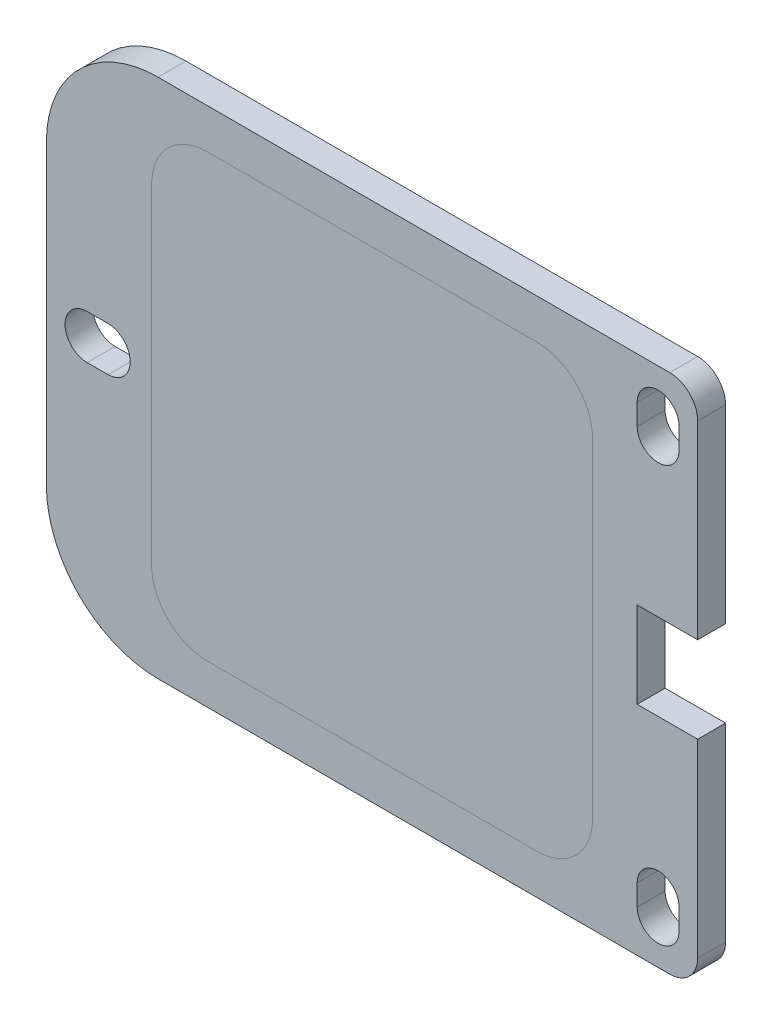
ISO-10303-21;
HEADER;
FILE_DESCRIPTION(('STEP AP214'),'2;1');
FILE_NAME('part.step','',(''),(''),'','','');
FILE_SCHEMA(('AUTOMOTIVE_DESIGN { 1 0 10303 214 1 1 1 1 }'));
ENDSEC;
DATA;
#1=APPLICATION_CONTEXT('core data for automotive mechanical design processes');
#2=APPLICATION_PROTOCOL_DEFINITION('international standard','automotive_design',2000,#1);
#3=PRODUCT_CONTEXT('',#1,'mechanical');
#4=PRODUCT('Part','Part','',(#3));
#5=PRODUCT_RELATED_PRODUCT_CATEGORY('part','',(#4));
#6=PRODUCT_DEFINITION_FORMATION('','',#4);
#7=PRODUCT_DEFINITION_CONTEXT('part definition',#1,'design');
#8=PRODUCT_DEFINITION('design','',#6,#7);
#9=PRODUCT_DEFINITION_SHAPE('','',#8);
#10=(LENGTH_UNIT() NAMED_UNIT(*) SI_UNIT(.MILLI.,.METRE.));
#11=(NAMED_UNIT(*) PLANE_ANGLE_UNIT() SI_UNIT($,.RADIAN.));
#12=(NAMED_UNIT(*) SI_UNIT($,.STERADIAN.) SOLID_ANGLE_UNIT());
#13=UNCERTAINTY_MEASURE_WITH_UNIT(LENGTH_MEASURE(1.E-05),#10,'distance_accuracy_value','');
#14=(GEOMETRIC_REPRESENTATION_CONTEXT(3) GLOBAL_UNCERTAINTY_ASSIGNED_CONTEXT((#13)) GLOBAL_UNIT_ASSIGNED_CONTEXT((#10,
#11,#12)) REPRESENTATION_CONTEXT('',''));
#15=CARTESIAN_POINT('',(0.,0.,0.));
#16=DIRECTION('',(0.,0.,1.));
#17=DIRECTION('',(1.,0.,0.));
#18=AXIS2_PLACEMENT_3D('',#15,#16,#17);
#19=CARTESIAN_POINT('',(0.,0.,19.05));
#20=DIRECTION('',(0.,0.,-1.));
#21=DIRECTION('',(-1.,0.,0.));
#22=AXIS2_PLACEMENT_3D('',#19,#20,#21);
#23=PLANE('',#22);
#24=CARTESIAN_POINT('',(195.2625,134.9248,19.05));
#25=DIRECTION('',(0.,0.,1.));
#26=DIRECTION('',(-1.,0.,0.));
#27=AXIS2_PLACEMENT_3D('',#24,#25,#26);
#28=CIRCLE('',#27,14.2875);
#29=CARTESIAN_POINT('',(180.975,134.9248,19.05));
#30=VERTEX_POINT('',#29);
#31=CARTESIAN_POINT('',(209.55,134.9248,19.05));
#32=VERTEX_POINT('',#31);
#33=EDGE_CURVE('E228',#30,#32,#28,.T.);
#34=ORIENTED_EDGE('',*,*,#33,.F.);
#35=DIRECTION('',(0.,-1.,0.));
#36=VECTOR('',#35,1.);
#37=CARTESIAN_POINT('',(180.975,134.9248,19.05));
#38=LINE('',#37,#36);
#39=CARTESIAN_POINT('',(180.975,149.225,19.05));
#40=VERTEX_POINT('',#39);
#41=EDGE_CURVE('E254',#40,#30,#38,.T.);
#42=ORIENTED_EDGE('',*,*,#41,.F.);
#43=CARTESIAN_POINT('',(195.2625,149.225,19.05));
#44=DIRECTION('',(0.,0.,1.));
#45=DIRECTION('',(-1.,0.,0.));
#46=AXIS2_PLACEMENT_3D('',#43,#44,#45);
#47=CIRCLE('',#46,14.2875);
#48=CARTESIAN_POINT('',(209.55,149.225,19.05));
#49=VERTEX_POINT('',#48);
#50=EDGE_CURVE('E252',#49,#40,#47,.T.);
#51=ORIENTED_EDGE('',*,*,#50,.F.);
#52=DIRECTION('',(0.,1.,0.));
#53=VECTOR('',#52,1.);
#54=CARTESIAN_POINT('',(209.55,134.9248,19.05));
#55=LINE('',#54,#53);
#56=EDGE_CURVE('E238',#32,#49,#55,.T.);
#57=ORIENTED_EDGE('',*,*,#56,.F.);
#58=EDGE_LOOP('',(#34,#42,#51,#57));
#59=FACE_BOUND('',#58,.T.);
#60=CARTESIAN_POINT('',(-194.4624,0.,19.05));
#61=DIRECTION('',(0.,0.,1.));
#62=DIRECTION('',(1.,0.,0.));
#63=AXIS2_PLACEMENT_3D('',#60,#61,#62);
#64=CIRCLE('',#63,15.08125);
#65=CARTESIAN_POINT('',(-194.4624,15.08125,19.05));
#66=VERTEX_POINT('',#65);
#67=CARTESIAN_POINT('',(-194.4624,-15.08125,19.05));
#68=VERTEX_POINT('',#67);
#69=EDGE_CURVE('E301',#66,#68,#64,.T.);
#70=ORIENTED_EDGE('',*,*,#69,.F.);
#71=DIRECTION('',(-1.,0.,0.));
#72=VECTOR('',#71,1.);
#73=CARTESIAN_POINT('',(-194.4624,15.08125,19.05));
#74=LINE('',#73,#72);
#75=CARTESIAN_POINT('',(-180.1749,15.08125,19.05));
#76=VERTEX_POINT('',#75);
#77=EDGE_CURVE('E309',#76,#66,#74,.T.);
#78=ORIENTED_EDGE('',*,*,#77,.F.);
#79=CARTESIAN_POINT('',(-180.1749,0.,19.05));
#80=DIRECTION('',(0.,0.,1.));
#81=DIRECTION('',(1.,0.,0.));
#82=AXIS2_PLACEMENT_3D('',#79,#80,#81);
#83=CIRCLE('',#82,15.08125);
#84=CARTESIAN_POINT('',(-180.1749,-15.08125,19.05));
#85=VERTEX_POINT('',#84);
#86=EDGE_CURVE('E306',#85,#76,#83,.T.);
#87=ORIENTED_EDGE('',*,*,#86,.F.);
#88=DIRECTION('',(1.,0.,0.));
#89=VECTOR('',#88,1.);
#90=CARTESIAN_POINT('',(-194.4624,-15.08125,19.05));
#91=LINE('',#90,#89);
#92=EDGE_CURVE('E303',#68,#85,#91,.T.);
#93=ORIENTED_EDGE('',*,*,#92,.F.);
#94=EDGE_LOOP('',(#70,#78,#87,#93));
#95=FACE_BOUND('',#94,.T.);
#96=DIRECTION('',(0.,1.,0.));
#97=VECTOR('',#96,1.);
#98=CARTESIAN_POINT('',(222.25,29.36875,19.05));
#99=LINE('',#98,#97);
#100=CARTESIAN_POINT('',(222.25,29.36875,19.05));
#101=VERTEX_POINT('',#100);
#102=CARTESIAN_POINT('',(222.25,158.75,19.05));
#103=VERTEX_POINT('',#102);
#104=EDGE_CURVE('E332',#101,#103,#99,.T.);
#105=ORIENTED_EDGE('',*,*,#104,.T.);
#106=CARTESIAN_POINT('',(203.2,158.75,19.05));
#107=DIRECTION('',(0.,0.,-1.));
#108=DIRECTION('',(-1.,0.,0.));
#109=AXIS2_PLACEMENT_3D('',#106,#107,#108);
#110=CIRCLE('',#109,19.05);
#111=CARTESIAN_POINT('',(203.2,177.8,19.05));
#112=VERTEX_POINT('',#111);
#113=EDGE_CURVE('E446',#103,#112,#110,.F.);
#114=ORIENTED_EDGE('',*,*,#113,.T.);
#115=DIRECTION('',(-1.,0.,0.));
#116=VECTOR('',#115,1.);
#117=CARTESIAN_POINT('',(-222.25,177.8,19.05));
#118=LINE('',#117,#116);
#119=CARTESIAN_POINT('',(-146.05,177.8,19.05));
#120=VERTEX_POINT('',#119);
#121=EDGE_CURVE('E335',#112,#120,#118,.T.);
#122=ORIENTED_EDGE('',*,*,#121,.T.);
#123=CARTESIAN_POINT('',(-146.05,101.6,19.05));
#124=DIRECTION('',(0.,0.,-1.));
#125=DIRECTION('',(-1.,0.,0.));
#126=AXIS2_PLACEMENT_3D('',#123,#124,#125);
#127=CIRCLE('',#126,76.2);
#128=CARTESIAN_POINT('',(-222.25,101.6,19.05));
#129=VERTEX_POINT('',#128);
#130=EDGE_CURVE('E431',#120,#129,#127,.F.);
#131=ORIENTED_EDGE('',*,*,#130,.T.);
#132=DIRECTION('',(0.,-1.,0.));
#133=VECTOR('',#132,1.);
#134=CARTESIAN_POINT('',(-222.25,-177.8,19.05));
#135=LINE('',#134,#133);
#136=CARTESIAN_POINT('',(-222.25,-101.6,19.05));
#137=VERTEX_POINT('',#136);
#138=EDGE_CURVE('E338',#129,#137,#135,.T.);
#139=ORIENTED_EDGE('',*,*,#138,.T.);
#140=CARTESIAN_POINT('',(-146.05,-101.6,19.05));
#141=DIRECTION('',(0.,0.,-1.));
#142=DIRECTION('',(-1.,0.,0.));
#143=AXIS2_PLACEMENT_3D('',#140,#141,#142);
#144=CIRCLE('',#143,76.2);
#145=CARTESIAN_POINT('',(-146.05,-177.8,19.05));
#146=VERTEX_POINT('',#145);
#147=EDGE_CURVE('E429',#137,#146,#144,.F.);
#148=ORIENTED_EDGE('',*,*,#147,.T.);
#149=DIRECTION('',(1.,0.,0.));
#150=VECTOR('',#149,1.);
#151=CARTESIAN_POINT('',(-222.25,-177.8,19.05));
#152=LINE('',#151,#150);
#153=CARTESIAN_POINT('',(203.2,-177.8,19.05));
#154=VERTEX_POINT('',#153);
#155=EDGE_CURVE('E341',#146,#154,#152,.T.);
#156=ORIENTED_EDGE('',*,*,#155,.T.);
#157=CARTESIAN_POINT('',(203.2,-158.75,19.05));
#158=DIRECTION('',(0.,0.,-1.));
#159=DIRECTION('',(-1.,0.,0.));
#160=AXIS2_PLACEMENT_3D('',#157,#158,#159);
#161=CIRCLE('',#160,19.05);
#162=CARTESIAN_POINT('',(222.25,-158.75,19.05));
#163=VERTEX_POINT('',#162);
#164=EDGE_CURVE('E57',#154,#163,#161,.F.);
#165=ORIENTED_EDGE('',*,*,#164,.T.);
#166=DIRECTION('',(0.,1.,0.));
#167=VECTOR('',#166,1.);
#168=CARTESIAN_POINT('',(222.25,-177.8,19.05));
#169=LINE('',#168,#167);
#170=CARTESIAN_POINT('',(222.25,-29.36875,19.05));
#171=VERTEX_POINT('',#170);
#172=EDGE_CURVE('E343',#163,#171,#169,.T.);
#173=ORIENTED_EDGE('',*,*,#172,.T.);
#174=DIRECTION('',(-1.,0.,0.));
#175=VECTOR('',#174,1.);
#176=CARTESIAN_POINT('',(222.25,-29.36875,19.05));
#177=LINE('',#176,#175);
#178=CARTESIAN_POINT('',(180.975,-29.36875,19.05));
#179=VERTEX_POINT('',#178);
#180=EDGE_CURVE('E345',#171,#179,#177,.T.);
#181=ORIENTED_EDGE('',*,*,#180,.T.);
#182=DIRECTION('',(0.,1.,0.));
#183=VECTOR('',#182,1.);
#184=CARTESIAN_POINT('',(180.975,29.36875,19.05));
#185=LINE('',#184,#183);
#186=CARTESIAN_POINT('',(180.975,29.36875,19.05));
#187=VERTEX_POINT('',#186);
#188=EDGE_CURVE('E347',#179,#187,#185,.T.);
#189=ORIENTED_EDGE('',*,*,#188,.T.);
#190=DIRECTION('',(1.,0.,0.));
#191=VECTOR('',#190,1.);
#192=CARTESIAN_POINT('',(222.25,29.36875,19.05));
#193=LINE('',#192,#191);
#194=EDGE_CURVE('E349',#187,#101,#193,.T.);
#195=ORIENTED_EDGE('',*,*,#194,.T.);
#196=EDGE_LOOP('',(#105,#114,#122,#131,#139,#148,#156,#165,#173,#181,#189,#195));
#197=FACE_BOUND('',#196,.T.);
#198=CARTESIAN_POINT('',(195.2625,-134.9248,19.05));
#199=DIRECTION('',(0.,0.,1.));
#200=DIRECTION('',(1.,0.,0.));
#201=AXIS2_PLACEMENT_3D('',#198,#199,#200);
#202=CIRCLE('',#201,14.2875);
#203=CARTESIAN_POINT('',(209.55,-134.9248,19.05));
#204=VERTEX_POINT('',#203);
#205=CARTESIAN_POINT('',(180.975,-134.9248,19.05));
#206=VERTEX_POINT('',#205);
#207=EDGE_CURVE('E270',#204,#206,#202,.T.);
#208=ORIENTED_EDGE('',*,*,#207,.F.);
#209=DIRECTION('',(0.,1.,0.));
#210=VECTOR('',#209,1.);
#211=CARTESIAN_POINT('',(209.55,-134.9248,19.05));
#212=LINE('',#211,#210);
#213=CARTESIAN_POINT('',(209.55,-149.225,19.05));
#214=VERTEX_POINT('',#213);
#215=EDGE_CURVE('E278',#214,#204,#212,.T.);
#216=ORIENTED_EDGE('',*,*,#215,.F.);
#217=CARTESIAN_POINT('',(195.2625,-149.225,19.05));
#218=DIRECTION('',(0.,0.,1.));
#219=DIRECTION('',(1.,0.,0.));
#220=AXIS2_PLACEMENT_3D('',#217,#218,#219);
#221=CIRCLE('',#220,14.2875);
#222=CARTESIAN_POINT('',(180.975,-149.225,19.05));
#223=VERTEX_POINT('',#222);
#224=EDGE_CURVE('E275',#223,#214,#221,.T.);
#225=ORIENTED_EDGE('',*,*,#224,.F.);
#226=DIRECTION('',(0.,-1.,0.));
#227=VECTOR('',#226,1.);
#228=CARTESIAN_POINT('',(180.975,-134.9248,19.05));
#229=LINE('',#228,#227);
#230=EDGE_CURVE('E272',#206,#223,#229,.T.);
#231=ORIENTED_EDGE('',*,*,#230,.F.);
#232=EDGE_LOOP('',(#208,#216,#225,#231));
#233=FACE_BOUND('',#232,.T.);
#234=CARTESIAN_POINT('',(112.395,-112.395,19.05));
#235=DIRECTION('',(0.,0.,-1.));
#236=DIRECTION('',(-1.,0.,0.));
#237=AXIS2_PLACEMENT_3D('',#234,#235,#236);
#238=CIRCLE('',#237,38.1);
#239=CARTESIAN_POINT('',(112.395,-150.495,19.05));
#240=VERTEX_POINT('',#239);
#241=CARTESIAN_POINT('',(150.495,-112.395,19.05));
#242=VERTEX_POINT('',#241);
#243=EDGE_CURVE('E413',#240,#242,#238,.F.);
#244=ORIENTED_EDGE('',*,*,#243,.F.);
#245=DIRECTION('',(1.,0.,0.));
#246=VECTOR('',#245,1.);
#247=CARTESIAN_POINT('',(0.,-150.495,19.05));
#248=LINE('',#247,#246);
#249=CARTESIAN_POINT('',(-112.395,-150.495,19.05));
#250=VERTEX_POINT('',#249);
#251=EDGE_CURVE('E391',#250,#240,#248,.T.);
#252=ORIENTED_EDGE('',*,*,#251,.F.);
#253=CARTESIAN_POINT('',(-112.395,-112.395,19.05));
#254=DIRECTION('',(0.,0.,-1.));
#255=DIRECTION('',(-1.,0.,0.));
#256=AXIS2_PLACEMENT_3D('',#253,#254,#255);
#257=CIRCLE('',#256,38.1);
#258=CARTESIAN_POINT('',(-150.495,-112.395,19.05));
#259=VERTEX_POINT('',#258);
#260=EDGE_CURVE('E395',#259,#250,#257,.F.);
#261=ORIENTED_EDGE('',*,*,#260,.F.);
#262=DIRECTION('',(0.,-1.,0.));
#263=VECTOR('',#262,1.);
#264=CARTESIAN_POINT('',(-150.495,0.,19.05));
#265=LINE('',#264,#263);
#266=CARTESIAN_POINT('',(-150.495,112.395,19.05));
#267=VERTEX_POINT('',#266);
#268=EDGE_CURVE('E398',#267,#259,#265,.T.);
#269=ORIENTED_EDGE('',*,*,#268,.F.);
#270=CARTESIAN_POINT('',(-112.395,112.395,19.05));
#271=DIRECTION('',(0.,0.,-1.));
#272=DIRECTION('',(-1.,0.,0.));
#273=AXIS2_PLACEMENT_3D('',#270,#271,#272);
#274=CIRCLE('',#273,38.1);
#275=CARTESIAN_POINT('',(-112.395,150.495,19.05));
#276=VERTEX_POINT('',#275);
#277=EDGE_CURVE('E401',#276,#267,#274,.F.);
#278=ORIENTED_EDGE('',*,*,#277,.F.);
#279=DIRECTION('',(-1.,0.,0.));
#280=VECTOR('',#279,1.);
#281=CARTESIAN_POINT('',(0.,150.495,19.05));
#282=LINE('',#281,#280);
#283=CARTESIAN_POINT('',(112.395,150.495,19.05));
#284=VERTEX_POINT('',#283);
#285=EDGE_CURVE('E404',#284,#276,#282,.T.);
#286=ORIENTED_EDGE('',*,*,#285,.F.);
#287=CARTESIAN_POINT('',(112.395,112.395,19.05));
#288=DIRECTION('',(0.,0.,-1.));
#289=DIRECTION('',(-1.,0.,0.));
#290=AXIS2_PLACEMENT_3D('',#287,#288,#289);
#291=CIRCLE('',#290,38.1);
#292=CARTESIAN_POINT('',(150.495,112.395,19.05));
#293=VERTEX_POINT('',#292);
#294=EDGE_CURVE('E407',#293,#284,#291,.F.);
#295=ORIENTED_EDGE('',*,*,#294,.F.);
#296=DIRECTION('',(0.,1.,0.));
#297=VECTOR('',#296,1.);
#298=CARTESIAN_POINT('',(150.495,0.,19.05));
#299=LINE('',#298,#297);
#300=EDGE_CURVE('E410',#242,#293,#299,.T.);
#301=ORIENTED_EDGE('',*,*,#300,.F.);
#302=EDGE_LOOP('',(#244,#252,#261,#269,#278,#286,#295,#301));
#303=FACE_BOUND('',#302,.T.);
#304=ADVANCED_FACE('F42',(#59,#95,#197,#233,#303),#23,.F.);
#305=CARTESIAN_POINT('',(0.,0.,0.));
#306=DIRECTION('',(0.,0.,-1.));
#307=DIRECTION('',(-1.,0.,0.));
#308=AXIS2_PLACEMENT_3D('',#305,#306,#307);
#309=PLANE('',#308);
#310=CARTESIAN_POINT('',(195.2625,-142.0749,0.));
#311=DIRECTION('',(0.,0.,-1.));
#312=DIRECTION('',(-1.,0.,0.));
#313=AXIS2_PLACEMENT_3D('',#310,#311,#312);
#314=CIRCLE('',#313,25.4);
#315=CARTESIAN_POINT('',(169.8625,-142.0749,0.));
#316=VERTEX_POINT('',#315);
#317=EDGE_CURVE('E383',#316,#316,#314,.F.);
#318=ORIENTED_EDGE('',*,*,#317,.T.);
#319=EDGE_LOOP('',(#318));
#320=FACE_BOUND('',#319,.T.);
#321=DIRECTION('',(-1.,0.,0.));
#322=VECTOR('',#321,1.);
#323=CARTESIAN_POINT('',(-222.25,177.8,0.));
#324=LINE('',#323,#322);
#325=CARTESIAN_POINT('',(203.2,177.8,0.));
#326=VERTEX_POINT('',#325);
#327=CARTESIAN_POINT('',(-146.05,177.8,0.));
#328=VERTEX_POINT('',#327);
#329=EDGE_CURVE('E354',#326,#328,#324,.T.);
#330=ORIENTED_EDGE('',*,*,#329,.F.);
#331=CARTESIAN_POINT('',(203.2,158.75,0.));
#332=DIRECTION('',(0.,0.,-1.));
#333=DIRECTION('',(-1.,0.,0.));
#334=AXIS2_PLACEMENT_3D('',#331,#332,#333);
#335=CIRCLE('',#334,19.05);
#336=CARTESIAN_POINT('',(222.25,158.75,0.));
#337=VERTEX_POINT('',#336);
#338=EDGE_CURVE('E441',#326,#337,#335,.T.);
#339=ORIENTED_EDGE('',*,*,#338,.T.);
#340=DIRECTION('',(0.,1.,0.));
#341=VECTOR('',#340,1.);
#342=CARTESIAN_POINT('',(222.25,29.36875,0.));
#343=LINE('',#342,#341);
#344=CARTESIAN_POINT('',(222.25,29.36875,0.));
#345=VERTEX_POINT('',#344);
#346=EDGE_CURVE('E331',#345,#337,#343,.T.);
#347=ORIENTED_EDGE('',*,*,#346,.F.);
#348=DIRECTION('',(1.,0.,0.));
#349=VECTOR('',#348,1.);
#350=CARTESIAN_POINT('',(222.25,29.36875,0.));
#351=LINE('',#350,#349);
#352=CARTESIAN_POINT('',(180.975,29.36875,0.));
#353=VERTEX_POINT('',#352);
#354=EDGE_CURVE('E336',#353,#345,#351,.T.);
#355=ORIENTED_EDGE('',*,*,#354,.F.);
#356=DIRECTION('',(0.,1.,0.));
#357=VECTOR('',#356,1.);
#358=CARTESIAN_POINT('',(180.975,29.36875,0.));
#359=LINE('',#358,#357);
#360=CARTESIAN_POINT('',(180.975,-29.36875,0.));
#361=VERTEX_POINT('',#360);
#362=EDGE_CURVE('E365',#361,#353,#359,.T.);
#363=ORIENTED_EDGE('',*,*,#362,.F.);
#364=DIRECTION('',(-1.,0.,0.));
#365=VECTOR('',#364,1.);
#366=CARTESIAN_POINT('',(222.25,-29.36875,0.));
#367=LINE('',#366,#365);
#368=CARTESIAN_POINT('',(222.25,-29.36875,0.));
#369=VERTEX_POINT('',#368);
#370=EDGE_CURVE('E363',#369,#361,#367,.T.);
#371=ORIENTED_EDGE('',*,*,#370,.F.);
#372=DIRECTION('',(0.,1.,0.));
#373=VECTOR('',#372,1.);
#374=CARTESIAN_POINT('',(222.25,-177.8,0.));
#375=LINE('',#374,#373);
#376=CARTESIAN_POINT('',(222.25,-158.75,0.));
#377=VERTEX_POINT('',#376);
#378=EDGE_CURVE('E361',#377,#369,#375,.T.);
#379=ORIENTED_EDGE('',*,*,#378,.F.);
#380=CARTESIAN_POINT('',(203.2,-158.75,0.));
#381=DIRECTION('',(0.,0.,-1.));
#382=DIRECTION('',(-1.,0.,0.));
#383=AXIS2_PLACEMENT_3D('',#380,#381,#382);
#384=CIRCLE('',#383,19.05);
#385=CARTESIAN_POINT('',(203.2,-177.8,0.));
#386=VERTEX_POINT('',#385);
#387=EDGE_CURVE('E439',#377,#386,#384,.T.);
#388=ORIENTED_EDGE('',*,*,#387,.T.);
#389=DIRECTION('',(1.,0.,0.));
#390=VECTOR('',#389,1.);
#391=CARTESIAN_POINT('',(-222.25,-177.8,0.));
#392=LINE('',#391,#390);
#393=CARTESIAN_POINT('',(-146.05,-177.8,0.));
#394=VERTEX_POINT('',#393);
#395=EDGE_CURVE('E359',#394,#386,#392,.T.);
#396=ORIENTED_EDGE('',*,*,#395,.F.);
#397=CARTESIAN_POINT('',(-146.05,-101.6,0.));
#398=DIRECTION('',(0.,0.,-1.));
#399=DIRECTION('',(-1.,0.,0.));
#400=AXIS2_PLACEMENT_3D('',#397,#398,#399);
#401=CIRCLE('',#400,76.2);
#402=CARTESIAN_POINT('',(-222.25,-101.6,0.));
#403=VERTEX_POINT('',#402);
#404=EDGE_CURVE('E421',#394,#403,#401,.T.);
#405=ORIENTED_EDGE('',*,*,#404,.T.);
#406=DIRECTION('',(0.,-1.,0.));
#407=VECTOR('',#406,1.);
#408=CARTESIAN_POINT('',(-222.25,-177.8,0.));
#409=LINE('',#408,#407);
#410=CARTESIAN_POINT('',(-222.25,101.6,0.));
#411=VERTEX_POINT('',#410);
#412=EDGE_CURVE('E356',#411,#403,#409,.T.);
#413=ORIENTED_EDGE('',*,*,#412,.F.);
#414=CARTESIAN_POINT('',(-146.05,101.6,0.));
#415=DIRECTION('',(0.,0.,-1.));
#416=DIRECTION('',(-1.,0.,0.));
#417=AXIS2_PLACEMENT_3D('',#414,#415,#416);
#418=CIRCLE('',#417,76.2);
#419=EDGE_CURVE('E423',#411,#328,#418,.T.);
#420=ORIENTED_EDGE('',*,*,#419,.T.);
#421=EDGE_LOOP('',(#330,#339,#347,#355,#363,#371,#379,#388,#396,#405,#413,#420));
#422=FACE_BOUND('',#421,.T.);
#423=CARTESIAN_POINT('',(195.2625,142.0749,0.));
#424=DIRECTION('',(0.,0.,-1.));
#425=DIRECTION('',(-1.,0.,0.));
#426=AXIS2_PLACEMENT_3D('',#423,#424,#425);
#427=CIRCLE('',#426,25.4);
#428=CARTESIAN_POINT('',(169.8625,142.0749,0.));
#429=VERTEX_POINT('',#428);
#430=EDGE_CURVE('E379',#429,#429,#427,.F.);
#431=ORIENTED_EDGE('',*,*,#430,.T.);
#432=EDGE_LOOP('',(#431));
#433=FACE_BOUND('',#432,.T.);
#434=CARTESIAN_POINT('',(-187.31865,0.,0.));
#435=DIRECTION('',(0.,0.,-1.));
#436=DIRECTION('',(-1.,0.,0.));
#437=AXIS2_PLACEMENT_3D('',#434,#435,#436);
#438=CIRCLE('',#437,25.4);
#439=CARTESIAN_POINT('',(-212.71865,0.,0.));
#440=VERTEX_POINT('',#439);
#441=EDGE_CURVE('E387',#440,#440,#438,.F.);
#442=ORIENTED_EDGE('',*,*,#441,.T.);
#443=EDGE_LOOP('',(#442));
#444=FACE_BOUND('',#443,.T.);
#445=ADVANCED_FACE('F457',(#320,#422,#433,#444),#309,.T.);
#446=ORIENTED_EDGE('',*,*,#441,.F.);
#447=EDGE_LOOP('',(#446));
#448=FACE_BOUND('',#447,.T.);
#449=DIRECTION('',(-1.,0.,0.));
#450=VECTOR('',#449,1.);
#451=CARTESIAN_POINT('',(-194.4624,15.08125,0.));
#452=LINE('',#451,#450);
#453=CARTESIAN_POINT('',(-180.1749,15.08125,0.));
#454=VERTEX_POINT('',#453);
#455=CARTESIAN_POINT('',(-194.4624,15.08125,0.));
#456=VERTEX_POINT('',#455);
#457=EDGE_CURVE('E304',#454,#456,#452,.T.);
#458=ORIENTED_EDGE('',*,*,#457,.T.);
#459=CARTESIAN_POINT('',(-194.4624,0.,0.));
#460=DIRECTION('',(0.,0.,1.));
#461=DIRECTION('',(1.,0.,0.));
#462=AXIS2_PLACEMENT_3D('',#459,#460,#461);
#463=CIRCLE('',#462,15.08125);
#464=CARTESIAN_POINT('',(-194.4624,-15.08125,0.));
#465=VERTEX_POINT('',#464);
#466=EDGE_CURVE('E300',#456,#465,#463,.T.);
#467=ORIENTED_EDGE('',*,*,#466,.T.);
#468=DIRECTION('',(1.,0.,0.));
#469=VECTOR('',#468,1.);
#470=CARTESIAN_POINT('',(-194.4624,-15.08125,0.));
#471=LINE('',#470,#469);
#472=CARTESIAN_POINT('',(-180.1749,-15.08125,0.));
#473=VERTEX_POINT('',#472);
#474=EDGE_CURVE('E314',#465,#473,#471,.T.);
#475=ORIENTED_EDGE('',*,*,#474,.T.);
#476=CARTESIAN_POINT('',(-180.1749,0.,0.));
#477=DIRECTION('',(0.,0.,1.));
#478=DIRECTION('',(1.,0.,0.));
#479=AXIS2_PLACEMENT_3D('',#476,#477,#478);
#480=CIRCLE('',#479,15.08125);
#481=EDGE_CURVE('E317',#473,#454,#480,.T.);
#482=ORIENTED_EDGE('',*,*,#481,.T.);
#483=EDGE_LOOP('',(#458,#467,#475,#482));
#484=FACE_BOUND('',#483,.T.);
#485=ADVANCED_FACE('F512',(#448,#484),#309,.T.);
#486=ORIENTED_EDGE('',*,*,#317,.F.);
#487=EDGE_LOOP('',(#486));
#488=FACE_BOUND('',#487,.T.);
#489=DIRECTION('',(0.,1.,0.));
#490=VECTOR('',#489,1.);
#491=CARTESIAN_POINT('',(209.55,-134.9248,0.));
#492=LINE('',#491,#490);
#493=CARTESIAN_POINT('',(209.55,-149.225,0.));
#494=VERTEX_POINT('',#493);
#495=CARTESIAN_POINT('',(209.55,-134.9248,0.));
#496=VERTEX_POINT('',#495);
#497=EDGE_CURVE('E273',#494,#496,#492,.T.);
#498=ORIENTED_EDGE('',*,*,#497,.T.);
#499=CARTESIAN_POINT('',(195.2625,-134.9248,0.));
#500=DIRECTION('',(0.,0.,1.));
#501=DIRECTION('',(1.,0.,0.));
#502=AXIS2_PLACEMENT_3D('',#499,#500,#501);
#503=CIRCLE('',#502,14.2875);
#504=CARTESIAN_POINT('',(180.975,-134.9248,0.));
#505=VERTEX_POINT('',#504);
#506=EDGE_CURVE('E246',#496,#505,#503,.T.);
#507=ORIENTED_EDGE('',*,*,#506,.T.);
#508=DIRECTION('',(0.,-1.,0.));
#509=VECTOR('',#508,1.);
#510=CARTESIAN_POINT('',(180.975,-134.9248,0.));
#511=LINE('',#510,#509);
#512=CARTESIAN_POINT('',(180.975,-149.225,0.));
#513=VERTEX_POINT('',#512);
#514=EDGE_CURVE('E283',#505,#513,#511,.T.);
#515=ORIENTED_EDGE('',*,*,#514,.T.);
#516=CARTESIAN_POINT('',(195.2625,-149.225,0.));
#517=DIRECTION('',(0.,0.,1.));
#518=DIRECTION('',(1.,0.,0.));
#519=AXIS2_PLACEMENT_3D('',#516,#517,#518);
#520=CIRCLE('',#519,14.2875);
#521=EDGE_CURVE('E286',#513,#494,#520,.T.);
#522=ORIENTED_EDGE('',*,*,#521,.T.);
#523=EDGE_LOOP('',(#498,#507,#515,#522));
#524=FACE_BOUND('',#523,.T.);
#525=ADVANCED_FACE('F518',(#488,#524),#309,.T.);
#526=ORIENTED_EDGE('',*,*,#251,.T.);
#527=ORIENTED_EDGE('',*,*,#243,.T.);
#528=ORIENTED_EDGE('',*,*,#300,.T.);
#529=ORIENTED_EDGE('',*,*,#294,.T.);
#530=ORIENTED_EDGE('',*,*,#285,.T.);
#531=ORIENTED_EDGE('',*,*,#277,.T.);
#532=ORIENTED_EDGE('',*,*,#268,.T.);
#533=ORIENTED_EDGE('',*,*,#260,.T.);
#534=EDGE_LOOP('',(#526,#527,#528,#529,#530,#531,#532,#533));
#535=FACE_BOUND('',#534,.T.);
#536=ADVANCED_FACE('F508',(#535),#23,.F.);
#537=ORIENTED_EDGE('',*,*,#430,.F.);
#538=EDGE_LOOP('',(#537));
#539=FACE_BOUND('',#538,.T.);
#540=DIRECTION('',(0.,-1.,0.));
#541=VECTOR('',#540,1.);
#542=CARTESIAN_POINT('',(180.975,134.9248,0.));
#543=LINE('',#542,#541);
#544=CARTESIAN_POINT('',(180.975,149.225,0.));
#545=VERTEX_POINT('',#544);
#546=CARTESIAN_POINT('',(180.975,134.9248,0.));
#547=VERTEX_POINT('',#546);
#548=EDGE_CURVE('E239',#545,#547,#543,.T.);
#549=ORIENTED_EDGE('',*,*,#548,.T.);
#550=CARTESIAN_POINT('',(195.2625,134.9248,0.));
#551=DIRECTION('',(0.,0.,1.));
#552=DIRECTION('',(-1.,0.,0.));
#553=AXIS2_PLACEMENT_3D('',#550,#551,#552);
#554=CIRCLE('',#553,14.2875);
#555=CARTESIAN_POINT('',(209.55,134.9248,0.));
#556=VERTEX_POINT('',#555);
#557=EDGE_CURVE('E258',#547,#556,#554,.T.);
#558=ORIENTED_EDGE('',*,*,#557,.T.);
#559=DIRECTION('',(0.,1.,0.));
#560=VECTOR('',#559,1.);
#561=CARTESIAN_POINT('',(209.55,134.9248,0.));
#562=LINE('',#561,#560);
#563=CARTESIAN_POINT('',(209.55,149.225,0.));
#564=VERTEX_POINT('',#563);
#565=EDGE_CURVE('E245',#556,#564,#562,.T.);
#566=ORIENTED_EDGE('',*,*,#565,.T.);
#567=CARTESIAN_POINT('',(195.2625,149.225,0.));
#568=DIRECTION('',(0.,0.,1.));
#569=DIRECTION('',(-1.,0.,0.));
#570=AXIS2_PLACEMENT_3D('',#567,#568,#569);
#571=CIRCLE('',#570,14.2875);
#572=EDGE_CURVE('E261',#564,#545,#571,.T.);
#573=ORIENTED_EDGE('',*,*,#572,.T.);
#574=EDGE_LOOP('',(#549,#558,#566,#573));
#575=FACE_BOUND('',#574,.T.);
#576=ADVANCED_FACE('F515',(#539,#575),#309,.T.);
#577=CARTESIAN_POINT('',(222.25,29.36875,19.05));
#578=DIRECTION('',(-1.,0.,0.));
#579=DIRECTION('',(0.,0.,1.));
#580=AXIS2_PLACEMENT_3D('',#577,#578,#579);
#581=PLANE('',#580);
#582=ORIENTED_EDGE('',*,*,#346,.T.);
#583=DIRECTION('',(0.,0.,-1.));
#584=VECTOR('',#583,1.);
#585=CARTESIAN_POINT('',(222.25,158.75,19.05));
#586=LINE('',#585,#584);
#587=EDGE_CURVE('E443',#337,#103,#586,.F.);
#588=ORIENTED_EDGE('',*,*,#587,.T.);
#589=ORIENTED_EDGE('',*,*,#104,.F.);
#590=DIRECTION('',(0.,0.,-1.));
#591=VECTOR('',#590,1.);
#592=CARTESIAN_POINT('',(222.25,29.36875,19.05));
#593=LINE('',#592,#591);
#594=EDGE_CURVE('E351',#101,#345,#593,.T.);
#595=ORIENTED_EDGE('',*,*,#594,.T.);
#596=EDGE_LOOP('',(#582,#588,#589,#595));
#597=FACE_BOUND('',#596,.T.);
#598=ADVANCED_FACE('F479',(#597),#581,.F.);
#599=CARTESIAN_POINT('',(-222.25,177.8,19.05));
#600=DIRECTION('',(0.,-1.,0.));
#601=DIRECTION('',(0.,0.,-1.));
#602=AXIS2_PLACEMENT_3D('',#599,#600,#601);
#603=PLANE('',#602);
#604=ORIENTED_EDGE('',*,*,#121,.F.);
#605=DIRECTION('',(0.,0.,-1.));
#606=VECTOR('',#605,1.);
#607=CARTESIAN_POINT('',(203.2,177.8,19.05));
#608=LINE('',#607,#606);
#609=EDGE_CURVE('E436',#112,#326,#608,.T.);
#610=ORIENTED_EDGE('',*,*,#609,.T.);
#611=ORIENTED_EDGE('',*,*,#329,.T.);
#612=DIRECTION('',(0.,0.,-1.));
#613=VECTOR('',#612,1.);
#614=CARTESIAN_POINT('',(-146.05,177.8,19.05));
#615=LINE('',#614,#613);
#616=EDGE_CURVE('E426',#328,#120,#615,.F.);
#617=ORIENTED_EDGE('',*,*,#616,.T.);
#618=EDGE_LOOP('',(#604,#610,#611,#617));
#619=FACE_BOUND('',#618,.T.);
#620=ADVANCED_FACE('F486',(#619),#603,.F.);
#621=CARTESIAN_POINT('',(-222.25,-177.8,19.05));
#622=DIRECTION('',(1.,0.,0.));
#623=DIRECTION('',(0.,0.,-1.));
#624=AXIS2_PLACEMENT_3D('',#621,#622,#623);
#625=PLANE('',#624);
#626=ORIENTED_EDGE('',*,*,#138,.F.);
#627=DIRECTION('',(0.,0.,-1.));
#628=VECTOR('',#627,1.);
#629=CARTESIAN_POINT('',(-222.25,101.6,19.05));
#630=LINE('',#629,#628);
#631=EDGE_CURVE('E418',#129,#411,#630,.T.);
#632=ORIENTED_EDGE('',*,*,#631,.T.);
#633=ORIENTED_EDGE('',*,*,#412,.T.);
#634=DIRECTION('',(0.,0.,-1.));
#635=VECTOR('',#634,1.);
#636=CARTESIAN_POINT('',(-222.25,-101.6,19.05));
#637=LINE('',#636,#635);
#638=EDGE_CURVE('E416',#403,#137,#637,.F.);
#639=ORIENTED_EDGE('',*,*,#638,.T.);
#640=EDGE_LOOP('',(#626,#632,#633,#639));
#641=FACE_BOUND('',#640,.T.);
#642=ADVANCED_FACE('F495',(#641),#625,.F.);
#643=CARTESIAN_POINT('',(-222.25,-177.8,19.05));
#644=DIRECTION('',(0.,1.,0.));
#645=DIRECTION('',(0.,0.,1.));
#646=AXIS2_PLACEMENT_3D('',#643,#644,#645);
#647=PLANE('',#646);
#648=ORIENTED_EDGE('',*,*,#395,.T.);
#649=DIRECTION('',(0.,0.,-1.));
#650=VECTOR('',#649,1.);
#651=CARTESIAN_POINT('',(203.2,-177.8,19.05));
#652=LINE('',#651,#650);
#653=EDGE_CURVE('E11',#386,#154,#652,.F.);
#654=ORIENTED_EDGE('',*,*,#653,.T.);
#655=ORIENTED_EDGE('',*,*,#155,.F.);
#656=DIRECTION('',(0.,0.,-1.));
#657=VECTOR('',#656,1.);
#658=CARTESIAN_POINT('',(-146.05,-177.8,19.05));
#659=LINE('',#658,#657);
#660=EDGE_CURVE('E433',#146,#394,#659,.T.);
#661=ORIENTED_EDGE('',*,*,#660,.T.);
#662=EDGE_LOOP('',(#648,#654,#655,#661));
#663=FACE_BOUND('',#662,.T.);
#664=ADVANCED_FACE('F501',(#663),#647,.F.);
#665=CARTESIAN_POINT('',(222.25,-177.8,19.05));
#666=DIRECTION('',(-1.,0.,0.));
#667=DIRECTION('',(0.,0.,1.));
#668=AXIS2_PLACEMENT_3D('',#665,#666,#667);
#669=PLANE('',#668);
#670=ORIENTED_EDGE('',*,*,#172,.F.);
#671=DIRECTION('',(0.,0.,-1.));
#672=VECTOR('',#671,1.);
#673=CARTESIAN_POINT('',(222.25,-158.75,19.05));
#674=LINE('',#673,#672);
#675=EDGE_CURVE('E50',#163,#377,#674,.T.);
#676=ORIENTED_EDGE('',*,*,#675,.T.);
#677=ORIENTED_EDGE('',*,*,#378,.T.);
#678=DIRECTION('',(0.,0.,-1.));
#679=VECTOR('',#678,1.);
#680=CARTESIAN_POINT('',(222.25,-29.36875,19.05));
#681=LINE('',#680,#679);
#682=EDGE_CURVE('E376',#171,#369,#681,.T.);
#683=ORIENTED_EDGE('',*,*,#682,.F.);
#684=EDGE_LOOP('',(#670,#676,#677,#683));
#685=FACE_BOUND('',#684,.T.);
#686=ADVANCED_FACE('F451',(#685),#669,.F.);
#687=CARTESIAN_POINT('',(222.25,-29.36875,19.05));
#688=DIRECTION('',(0.,-1.,0.));
#689=DIRECTION('',(1.,0.,0.));
#690=AXIS2_PLACEMENT_3D('',#687,#688,#689);
#691=PLANE('',#690);
#692=ORIENTED_EDGE('',*,*,#370,.T.);
#693=DIRECTION('',(0.,0.,-1.));
#694=VECTOR('',#693,1.);
#695=CARTESIAN_POINT('',(180.975,-29.36875,19.05));
#696=LINE('',#695,#694);
#697=EDGE_CURVE('E373',#179,#361,#696,.T.);
#698=ORIENTED_EDGE('',*,*,#697,.F.);
#699=ORIENTED_EDGE('',*,*,#180,.F.);
#700=ORIENTED_EDGE('',*,*,#682,.T.);
#701=EDGE_LOOP('',(#692,#698,#699,#700));
#702=FACE_BOUND('',#701,.T.);
#703=ADVANCED_FACE('F464',(#702),#691,.F.);
#704=CARTESIAN_POINT('',(180.975,29.36875,19.05));
#705=DIRECTION('',(-1.,0.,0.));
#706=DIRECTION('',(0.,0.,1.));
#707=AXIS2_PLACEMENT_3D('',#704,#705,#706);
#708=PLANE('',#707);
#709=ORIENTED_EDGE('',*,*,#362,.T.);
#710=DIRECTION('',(0.,0.,-1.));
#711=VECTOR('',#710,1.);
#712=CARTESIAN_POINT('',(180.975,29.36875,19.05));
#713=LINE('',#712,#711);
#714=EDGE_CURVE('E370',#187,#353,#713,.T.);
#715=ORIENTED_EDGE('',*,*,#714,.F.);
#716=ORIENTED_EDGE('',*,*,#188,.F.);
#717=ORIENTED_EDGE('',*,*,#697,.T.);
#718=EDGE_LOOP('',(#709,#715,#716,#717));
#719=FACE_BOUND('',#718,.T.);
#720=ADVANCED_FACE('F468',(#719),#708,.F.);
#721=CARTESIAN_POINT('',(222.25,29.36875,19.05));
#722=DIRECTION('',(0.,1.,0.));
#723=DIRECTION('',(-1.,0.,0.));
#724=AXIS2_PLACEMENT_3D('',#721,#722,#723);
#725=PLANE('',#724);
#726=ORIENTED_EDGE('',*,*,#354,.T.);
#727=ORIENTED_EDGE('',*,*,#594,.F.);
#728=ORIENTED_EDGE('',*,*,#194,.F.);
#729=ORIENTED_EDGE('',*,*,#714,.T.);
#730=EDGE_LOOP('',(#726,#727,#728,#729));
#731=FACE_BOUND('',#730,.T.);
#732=ADVANCED_FACE('F476',(#731),#725,.F.);
#733=CARTESIAN_POINT('',(-194.4624,0.,19.05));
#734=DIRECTION('',(0.,0.,-1.));
#735=DIRECTION('',(-1.,0.,0.));
#736=AXIS2_PLACEMENT_3D('',#733,#734,#735);
#737=CYLINDRICAL_SURFACE('',#736,15.08125);
#738=ORIENTED_EDGE('',*,*,#466,.F.);
#739=DIRECTION('',(0.,0.,-1.));
#740=VECTOR('',#739,1.);
#741=CARTESIAN_POINT('',(-194.4624,15.08125,19.05));
#742=LINE('',#741,#740);
#743=EDGE_CURVE('E311',#66,#456,#742,.T.);
#744=ORIENTED_EDGE('',*,*,#743,.F.);
#745=ORIENTED_EDGE('',*,*,#69,.T.);
#746=DIRECTION('',(0.,0.,-1.));
#747=VECTOR('',#746,1.);
#748=CARTESIAN_POINT('',(-194.4624,-15.08125,19.05));
#749=LINE('',#748,#747);
#750=EDGE_CURVE('E328',#68,#465,#749,.T.);
#751=ORIENTED_EDGE('',*,*,#750,.T.);
#752=EDGE_LOOP('',(#738,#744,#745,#751));
#753=FACE_BOUND('',#752,.T.);
#754=ADVANCED_FACE('F543',(#753),#737,.F.);
#755=CARTESIAN_POINT('',(-194.4624,-15.08125,19.05));
#756=DIRECTION('',(0.,1.,0.));
#757=DIRECTION('',(0.,0.,1.));
#758=AXIS2_PLACEMENT_3D('',#755,#756,#757);
#759=PLANE('',#758);
#760=ORIENTED_EDGE('',*,*,#474,.F.);
#761=ORIENTED_EDGE('',*,*,#750,.F.);
#762=ORIENTED_EDGE('',*,*,#92,.T.);
#763=DIRECTION('',(0.,0.,-1.));
#764=VECTOR('',#763,1.);
#765=CARTESIAN_POINT('',(-180.1749,-15.08125,19.05));
#766=LINE('',#765,#764);
#767=EDGE_CURVE('E326',#85,#473,#766,.T.);
#768=ORIENTED_EDGE('',*,*,#767,.T.);
#769=EDGE_LOOP('',(#760,#761,#762,#768));
#770=FACE_BOUND('',#769,.T.);
#771=ADVANCED_FACE('F742',(#770),#759,.T.);
#772=CARTESIAN_POINT('',(-180.1749,0.,19.05));
#773=DIRECTION('',(0.,0.,-1.));
#774=DIRECTION('',(-1.,0.,0.));
#775=AXIS2_PLACEMENT_3D('',#772,#773,#774);
#776=CYLINDRICAL_SURFACE('',#775,15.08125);
#777=ORIENTED_EDGE('',*,*,#481,.F.);
#778=ORIENTED_EDGE('',*,*,#767,.F.);
#779=ORIENTED_EDGE('',*,*,#86,.T.);
#780=DIRECTION('',(0.,0.,-1.));
#781=VECTOR('',#780,1.);
#782=CARTESIAN_POINT('',(-180.1749,15.08125,19.05));
#783=LINE('',#782,#781);
#784=EDGE_CURVE('E324',#76,#454,#783,.T.);
#785=ORIENTED_EDGE('',*,*,#784,.T.);
#786=EDGE_LOOP('',(#777,#778,#779,#785));
#787=FACE_BOUND('',#786,.T.);
#788=ADVANCED_FACE('F732',(#787),#776,.F.);
#789=CARTESIAN_POINT('',(-194.4624,15.08125,19.05));
#790=DIRECTION('',(0.,-1.,0.));
#791=DIRECTION('',(0.,0.,-1.));
#792=AXIS2_PLACEMENT_3D('',#789,#790,#791);
#793=PLANE('',#792);
#794=ORIENTED_EDGE('',*,*,#457,.F.);
#795=ORIENTED_EDGE('',*,*,#784,.F.);
#796=ORIENTED_EDGE('',*,*,#77,.T.);
#797=ORIENTED_EDGE('',*,*,#743,.T.);
#798=EDGE_LOOP('',(#794,#795,#796,#797));
#799=FACE_BOUND('',#798,.T.);
#800=ADVANCED_FACE('F722',(#799),#793,.T.);
#801=CARTESIAN_POINT('',(195.2625,-134.9248,19.05));
#802=DIRECTION('',(0.,0.,-1.));
#803=DIRECTION('',(-1.,0.,0.));
#804=AXIS2_PLACEMENT_3D('',#801,#802,#803);
#805=CYLINDRICAL_SURFACE('',#804,14.2875);
#806=ORIENTED_EDGE('',*,*,#506,.F.);
#807=DIRECTION('',(0.,0.,-1.));
#808=VECTOR('',#807,1.);
#809=CARTESIAN_POINT('',(209.55,-134.9248,19.05));
#810=LINE('',#809,#808);
#811=EDGE_CURVE('E280',#204,#496,#810,.T.);
#812=ORIENTED_EDGE('',*,*,#811,.F.);
#813=ORIENTED_EDGE('',*,*,#207,.T.);
#814=DIRECTION('',(0.,0.,-1.));
#815=VECTOR('',#814,1.);
#816=CARTESIAN_POINT('',(180.975,-134.9248,19.05));
#817=LINE('',#816,#815);
#818=EDGE_CURVE('E297',#206,#505,#817,.T.);
#819=ORIENTED_EDGE('',*,*,#818,.T.);
#820=EDGE_LOOP('',(#806,#812,#813,#819));
#821=FACE_BOUND('',#820,.T.);
#822=ADVANCED_FACE('F712',(#821),#805,.F.);
#823=CARTESIAN_POINT('',(180.975,-134.9248,19.05));
#824=DIRECTION('',(1.,0.,0.));
#825=DIRECTION('',(0.,1.,0.));
#826=AXIS2_PLACEMENT_3D('',#823,#824,#825);
#827=PLANE('',#826);
#828=ORIENTED_EDGE('',*,*,#514,.F.);
#829=ORIENTED_EDGE('',*,*,#818,.F.);
#830=ORIENTED_EDGE('',*,*,#230,.T.);
#831=DIRECTION('',(0.,0.,-1.));
#832=VECTOR('',#831,1.);
#833=CARTESIAN_POINT('',(180.975,-149.225,19.05));
#834=LINE('',#833,#832);
#835=EDGE_CURVE('E295',#223,#513,#834,.T.);
#836=ORIENTED_EDGE('',*,*,#835,.T.);
#837=EDGE_LOOP('',(#828,#829,#830,#836));
#838=FACE_BOUND('',#837,.T.);
#839=ADVANCED_FACE('F702',(#838),#827,.T.);
#840=CARTESIAN_POINT('',(195.2625,-149.225,19.05));
#841=DIRECTION('',(0.,0.,-1.));
#842=DIRECTION('',(-1.,0.,0.));
#843=AXIS2_PLACEMENT_3D('',#840,#841,#842);
#844=CYLINDRICAL_SURFACE('',#843,14.2875);
#845=ORIENTED_EDGE('',*,*,#521,.F.);
#846=ORIENTED_EDGE('',*,*,#835,.F.);
#847=ORIENTED_EDGE('',*,*,#224,.T.);
#848=DIRECTION('',(0.,0.,-1.));
#849=VECTOR('',#848,1.);
#850=CARTESIAN_POINT('',(209.55,-149.225,19.05));
#851=LINE('',#850,#849);
#852=EDGE_CURVE('E293',#214,#494,#851,.T.);
#853=ORIENTED_EDGE('',*,*,#852,.T.);
#854=EDGE_LOOP('',(#845,#846,#847,#853));
#855=FACE_BOUND('',#854,.T.);
#856=ADVANCED_FACE('F692',(#855),#844,.F.);
#857=CARTESIAN_POINT('',(209.55,-134.9248,19.05));
#858=DIRECTION('',(-1.,0.,0.));
#859=DIRECTION('',(0.,-1.,0.));
#860=AXIS2_PLACEMENT_3D('',#857,#858,#859);
#861=PLANE('',#860);
#862=ORIENTED_EDGE('',*,*,#497,.F.);
#863=ORIENTED_EDGE('',*,*,#852,.F.);
#864=ORIENTED_EDGE('',*,*,#215,.T.);
#865=ORIENTED_EDGE('',*,*,#811,.T.);
#866=EDGE_LOOP('',(#862,#863,#864,#865));
#867=FACE_BOUND('',#866,.T.);
#868=ADVANCED_FACE('F683',(#867),#861,.T.);
#869=CARTESIAN_POINT('',(195.2625,134.9248,19.05));
#870=DIRECTION('',(0.,0.,-1.));
#871=DIRECTION('',(-1.,0.,0.));
#872=AXIS2_PLACEMENT_3D('',#869,#870,#871);
#873=CYLINDRICAL_SURFACE('',#872,14.2875);
#874=ORIENTED_EDGE('',*,*,#557,.F.);
#875=DIRECTION('',(0.,0.,-1.));
#876=VECTOR('',#875,1.);
#877=CARTESIAN_POINT('',(180.975,134.9248,19.05));
#878=LINE('',#877,#876);
#879=EDGE_CURVE('E234',#30,#547,#878,.T.);
#880=ORIENTED_EDGE('',*,*,#879,.F.);
#881=ORIENTED_EDGE('',*,*,#33,.T.);
#882=DIRECTION('',(0.,0.,-1.));
#883=VECTOR('',#882,1.);
#884=CARTESIAN_POINT('',(209.55,134.9248,19.05));
#885=LINE('',#884,#883);
#886=EDGE_CURVE('E231',#32,#556,#885,.T.);
#887=ORIENTED_EDGE('',*,*,#886,.T.);
#888=EDGE_LOOP('',(#874,#880,#881,#887));
#889=FACE_BOUND('',#888,.T.);
#890=ADVANCED_FACE('F230',(#889),#873,.F.);
#891=CARTESIAN_POINT('',(209.55,134.9248,19.05));
#892=DIRECTION('',(-1.,0.,0.));
#893=DIRECTION('',(0.,-1.,0.));
#894=AXIS2_PLACEMENT_3D('',#891,#892,#893);
#895=PLANE('',#894);
#896=ORIENTED_EDGE('',*,*,#565,.F.);
#897=ORIENTED_EDGE('',*,*,#886,.F.);
#898=ORIENTED_EDGE('',*,*,#56,.T.);
#899=DIRECTION('',(0.,0.,-1.));
#900=VECTOR('',#899,1.);
#901=CARTESIAN_POINT('',(209.55,149.225,19.05));
#902=LINE('',#901,#900);
#903=EDGE_CURVE('E247',#49,#564,#902,.T.);
#904=ORIENTED_EDGE('',*,*,#903,.T.);
#905=EDGE_LOOP('',(#896,#897,#898,#904));
#906=FACE_BOUND('',#905,.T.);
#907=ADVANCED_FACE('F242',(#906),#895,.T.);
#908=CARTESIAN_POINT('',(195.2625,149.225,19.05));
#909=DIRECTION('',(0.,0.,-1.));
#910=DIRECTION('',(-1.,0.,0.));
#911=AXIS2_PLACEMENT_3D('',#908,#909,#910);
#912=CYLINDRICAL_SURFACE('',#911,14.2875);
#913=ORIENTED_EDGE('',*,*,#572,.F.);
#914=ORIENTED_EDGE('',*,*,#903,.F.);
#915=ORIENTED_EDGE('',*,*,#50,.T.);
#916=DIRECTION('',(0.,0.,-1.));
#917=VECTOR('',#916,1.);
#918=CARTESIAN_POINT('',(180.975,149.225,19.05));
#919=LINE('',#918,#917);
#920=EDGE_CURVE('E267',#40,#545,#919,.T.);
#921=ORIENTED_EDGE('',*,*,#920,.T.);
#922=EDGE_LOOP('',(#913,#914,#915,#921));
#923=FACE_BOUND('',#922,.T.);
#924=ADVANCED_FACE('F656',(#923),#912,.F.);
#925=CARTESIAN_POINT('',(180.975,134.9248,19.05));
#926=DIRECTION('',(1.,0.,0.));
#927=DIRECTION('',(0.,1.,0.));
#928=AXIS2_PLACEMENT_3D('',#925,#926,#927);
#929=PLANE('',#928);
#930=ORIENTED_EDGE('',*,*,#548,.F.);
#931=ORIENTED_EDGE('',*,*,#920,.F.);
#932=ORIENTED_EDGE('',*,*,#41,.T.);
#933=ORIENTED_EDGE('',*,*,#879,.T.);
#934=EDGE_LOOP('',(#930,#931,#932,#933));
#935=FACE_BOUND('',#934,.T.);
#936=ADVANCED_FACE('F560',(#935),#929,.T.);
#937=CARTESIAN_POINT('',(-146.05,101.6,19.05));
#938=DIRECTION('',(0.,0.,-1.));
#939=DIRECTION('',(-1.,0.,0.));
#940=AXIS2_PLACEMENT_3D('',#937,#938,#939);
#941=CYLINDRICAL_SURFACE('',#940,76.2);
#942=ORIENTED_EDGE('',*,*,#130,.F.);
#943=ORIENTED_EDGE('',*,*,#616,.F.);
#944=ORIENTED_EDGE('',*,*,#419,.F.);
#945=ORIENTED_EDGE('',*,*,#631,.F.);
#946=EDGE_LOOP('',(#942,#943,#944,#945));
#947=FACE_BOUND('',#946,.T.);
#948=ADVANCED_FACE('F491',(#947),#941,.T.);
#949=CARTESIAN_POINT('',(-146.05,-101.6,19.05));
#950=DIRECTION('',(0.,0.,-1.));
#951=DIRECTION('',(-1.,0.,0.));
#952=AXIS2_PLACEMENT_3D('',#949,#950,#951);
#953=CYLINDRICAL_SURFACE('',#952,76.2);
#954=ORIENTED_EDGE('',*,*,#147,.F.);
#955=ORIENTED_EDGE('',*,*,#638,.F.);
#956=ORIENTED_EDGE('',*,*,#404,.F.);
#957=ORIENTED_EDGE('',*,*,#660,.F.);
#958=EDGE_LOOP('',(#954,#955,#956,#957));
#959=FACE_BOUND('',#958,.T.);
#960=ADVANCED_FACE('F499',(#959),#953,.T.);
#961=CARTESIAN_POINT('',(203.2,158.75,19.05));
#962=DIRECTION('',(0.,0.,-1.));
#963=DIRECTION('',(-1.,0.,0.));
#964=AXIS2_PLACEMENT_3D('',#961,#962,#963);
#965=CYLINDRICAL_SURFACE('',#964,19.05);
#966=ORIENTED_EDGE('',*,*,#113,.F.);
#967=ORIENTED_EDGE('',*,*,#587,.F.);
#968=ORIENTED_EDGE('',*,*,#338,.F.);
#969=ORIENTED_EDGE('',*,*,#609,.F.);
#970=EDGE_LOOP('',(#966,#967,#968,#969));
#971=FACE_BOUND('',#970,.T.);
#972=ADVANCED_FACE('F482',(#971),#965,.T.);
#973=CARTESIAN_POINT('',(203.2,-158.75,19.05));
#974=DIRECTION('',(0.,0.,-1.));
#975=DIRECTION('',(-1.,0.,0.));
#976=AXIS2_PLACEMENT_3D('',#973,#974,#975);
#977=CYLINDRICAL_SURFACE('',#976,19.05);
#978=ORIENTED_EDGE('',*,*,#164,.F.);
#979=ORIENTED_EDGE('',*,*,#653,.F.);
#980=ORIENTED_EDGE('',*,*,#387,.F.);
#981=ORIENTED_EDGE('',*,*,#675,.F.);
#982=EDGE_LOOP('',(#978,#979,#980,#981));
#983=FACE_BOUND('',#982,.T.);
#984=ADVANCED_FACE('F44',(#983),#977,.T.);
#985=CLOSED_SHELL('',(#304,#445,#485,#525,#536,#576,#598,#620,#642,#664,#686,#703,#720,#732,
#754,#771,#788,#800,#822,#839,#856,#868,#890,#907,#924,#936,#948,#960,#972,#984));
#986=MANIFOLD_SOLID_BREP('B2',#985);
#987=ADVANCED_BREP_SHAPE_REPRESENTATION('',(#18,#986),#14);
#988=SHAPE_DEFINITION_REPRESENTATION(#9,#987);
ENDSEC;
END-ISO-10303-21;
